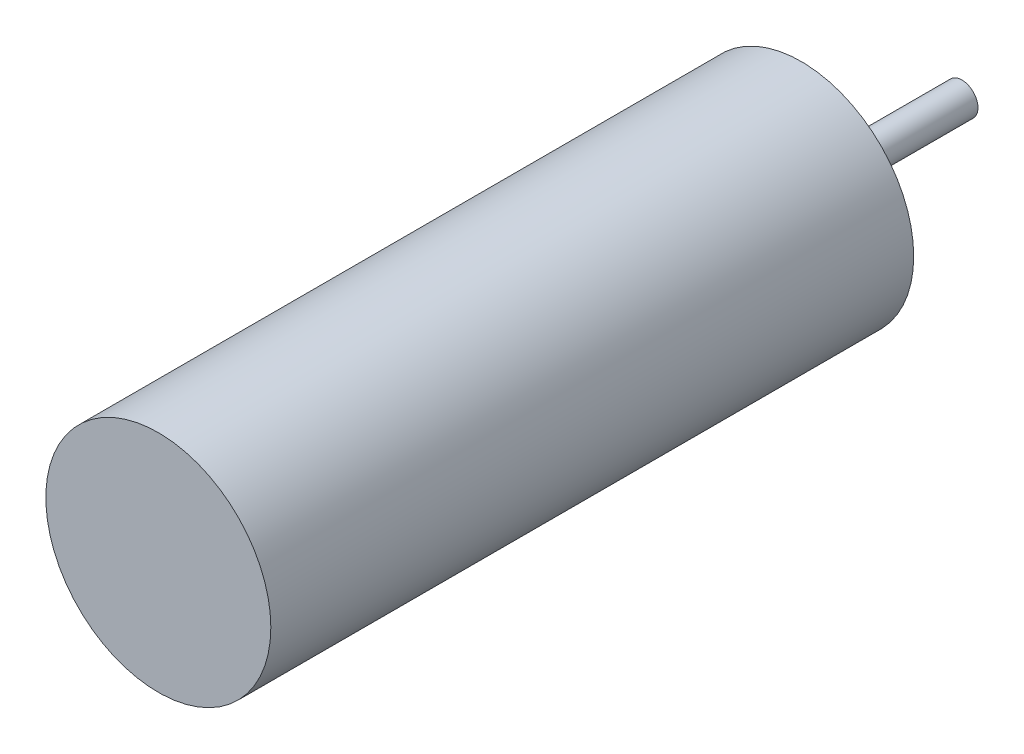
ISO-10303-21;
HEADER;
FILE_DESCRIPTION(('STEP AP214'),'2;1');
FILE_NAME('part.step','',(''),(''),'','','');
FILE_SCHEMA(('AUTOMOTIVE_DESIGN { 1 0 10303 214 1 1 1 1 }'));
ENDSEC;
DATA;
#1=APPLICATION_CONTEXT('core data for automotive mechanical design processes');
#2=APPLICATION_PROTOCOL_DEFINITION('international standard','automotive_design',2000,#1);
#3=PRODUCT_CONTEXT('',#1,'mechanical');
#4=PRODUCT('Part','Part','',(#3));
#5=PRODUCT_RELATED_PRODUCT_CATEGORY('part','',(#4));
#6=PRODUCT_DEFINITION_FORMATION('','',#4);
#7=PRODUCT_DEFINITION_CONTEXT('part definition',#1,'design');
#8=PRODUCT_DEFINITION('design','',#6,#7);
#9=PRODUCT_DEFINITION_SHAPE('','',#8);
#10=(LENGTH_UNIT() NAMED_UNIT(*) SI_UNIT(.MILLI.,.METRE.));
#11=(NAMED_UNIT(*) PLANE_ANGLE_UNIT() SI_UNIT($,.RADIAN.));
#12=(NAMED_UNIT(*) SI_UNIT($,.STERADIAN.) SOLID_ANGLE_UNIT());
#13=UNCERTAINTY_MEASURE_WITH_UNIT(LENGTH_MEASURE(1.E-05),#10,'distance_accuracy_value','');
#14=(GEOMETRIC_REPRESENTATION_CONTEXT(3) GLOBAL_UNCERTAINTY_ASSIGNED_CONTEXT((#13)) GLOBAL_UNIT_ASSIGNED_CONTEXT((#10,
#11,#12)) REPRESENTATION_CONTEXT('',''));
#15=CARTESIAN_POINT('',(0.,0.,0.));
#16=DIRECTION('',(0.,0.,1.));
#17=DIRECTION('',(1.,0.,0.));
#18=AXIS2_PLACEMENT_3D('',#15,#16,#17);
#19=CARTESIAN_POINT('',(0.,0.,20.));
#20=DIRECTION('',(0.,0.,-1.));
#21=DIRECTION('',(-1.,0.,0.));
#22=AXIS2_PLACEMENT_3D('',#19,#20,#21);
#23=CYLINDRICAL_SURFACE('',#22,3.5);
#24=CARTESIAN_POINT('',(0.,0.,20.));
#25=DIRECTION('',(0.,0.,1.));
#26=DIRECTION('',(1.,0.,0.));
#27=AXIS2_PLACEMENT_3D('',#24,#25,#26);
#28=CIRCLE('',#27,3.5);
#29=CARTESIAN_POINT('',(3.5,0.,20.));
#30=VERTEX_POINT('',#29);
#31=EDGE_CURVE('E46',#30,#30,#28,.T.);
#32=ORIENTED_EDGE('',*,*,#31,.F.);
#33=EDGE_LOOP('',(#32));
#34=FACE_BOUND('',#33,.T.);
#35=CARTESIAN_POINT('',(0.,0.,0.));
#36=DIRECTION('',(0.,0.,1.));
#37=DIRECTION('',(1.,0.,0.));
#38=AXIS2_PLACEMENT_3D('',#35,#36,#37);
#39=CIRCLE('',#38,3.5);
#40=CARTESIAN_POINT('',(3.5,0.,0.));
#41=VERTEX_POINT('',#40);
#42=EDGE_CURVE('E51',#41,#41,#39,.T.);
#43=ORIENTED_EDGE('',*,*,#42,.T.);
#44=EDGE_LOOP('',(#43));
#45=FACE_BOUND('',#44,.T.);
#46=ADVANCED_FACE('F39',(#34,#45),#23,.T.);
#47=CARTESIAN_POINT('',(0.,0.,20.));
#48=DIRECTION('',(0.,0.,1.));
#49=DIRECTION('',(1.,0.,0.));
#50=AXIS2_PLACEMENT_3D('',#47,#48,#49);
#51=PLANE('',#50);
#52=ORIENTED_EDGE('',*,*,#31,.T.);
#53=EDGE_LOOP('',(#52));
#54=FACE_BOUND('',#53,.T.);
#55=ADVANCED_FACE('F74',(#54),#51,.T.);
#56=CARTESIAN_POINT('',(0.,0.,0.));
#57=DIRECTION('',(0.,0.,1.));
#58=DIRECTION('',(1.,0.,0.));
#59=AXIS2_PLACEMENT_3D('',#56,#57,#58);
#60=PLANE('',#59);
#61=CARTESIAN_POINT('',(0.,0.,0.));
#62=DIRECTION('',(0.,0.,1.));
#63=DIRECTION('',(1.,0.,0.));
#64=AXIS2_PLACEMENT_3D('',#61,#62,#63);
#65=CIRCLE('',#64,0.5);
#66=CARTESIAN_POINT('',(0.5,0.,0.));
#67=VERTEX_POINT('',#66);
#68=EDGE_CURVE('E10',#67,#67,#65,.F.);
#69=ORIENTED_EDGE('',*,*,#68,.F.);
#70=EDGE_LOOP('',(#69));
#71=FACE_BOUND('',#70,.T.);
#72=ORIENTED_EDGE('',*,*,#42,.F.);
#73=EDGE_LOOP('',(#72));
#74=FACE_BOUND('',#73,.T.);
#75=ADVANCED_FACE('F67',(#71,#74),#60,.F.);
#76=CARTESIAN_POINT('',(0.,0.,-5.));
#77=DIRECTION('',(0.,0.,1.));
#78=DIRECTION('',(1.,0.,0.));
#79=AXIS2_PLACEMENT_3D('',#76,#77,#78);
#80=CYLINDRICAL_SURFACE('',#79,0.5);
#81=CARTESIAN_POINT('',(0.,0.,-5.));
#82=DIRECTION('',(0.,0.,-1.));
#83=DIRECTION('',(-1.,0.,0.));
#84=AXIS2_PLACEMENT_3D('',#81,#82,#83);
#85=CIRCLE('',#84,0.5);
#86=CARTESIAN_POINT('',(-0.5,0.,-5.));
#87=VERTEX_POINT('',#86);
#88=EDGE_CURVE('E57',#87,#87,#85,.T.);
#89=ORIENTED_EDGE('',*,*,#88,.F.);
#90=EDGE_LOOP('',(#89));
#91=FACE_BOUND('',#90,.T.);
#92=ORIENTED_EDGE('',*,*,#68,.T.);
#93=EDGE_LOOP('',(#92));
#94=FACE_BOUND('',#93,.T.);
#95=ADVANCED_FACE('F65',(#91,#94),#80,.T.);
#96=CARTESIAN_POINT('',(0.,0.,-5.));
#97=DIRECTION('',(0.,0.,-1.));
#98=DIRECTION('',(-1.,0.,0.));
#99=AXIS2_PLACEMENT_3D('',#96,#97,#98);
#100=PLANE('',#99);
#101=ORIENTED_EDGE('',*,*,#88,.T.);
#102=EDGE_LOOP('',(#101));
#103=FACE_BOUND('',#102,.T.);
#104=ADVANCED_FACE('F63',(#103),#100,.T.);
#105=CLOSED_SHELL('',(#46,#55,#75,#95,#104));
#106=MANIFOLD_SOLID_BREP('B2',#105);
#107=ADVANCED_BREP_SHAPE_REPRESENTATION('',(#18,#106),#14);
#108=SHAPE_DEFINITION_REPRESENTATION(#9,#107);
ENDSEC;
END-ISO-10303-21;
